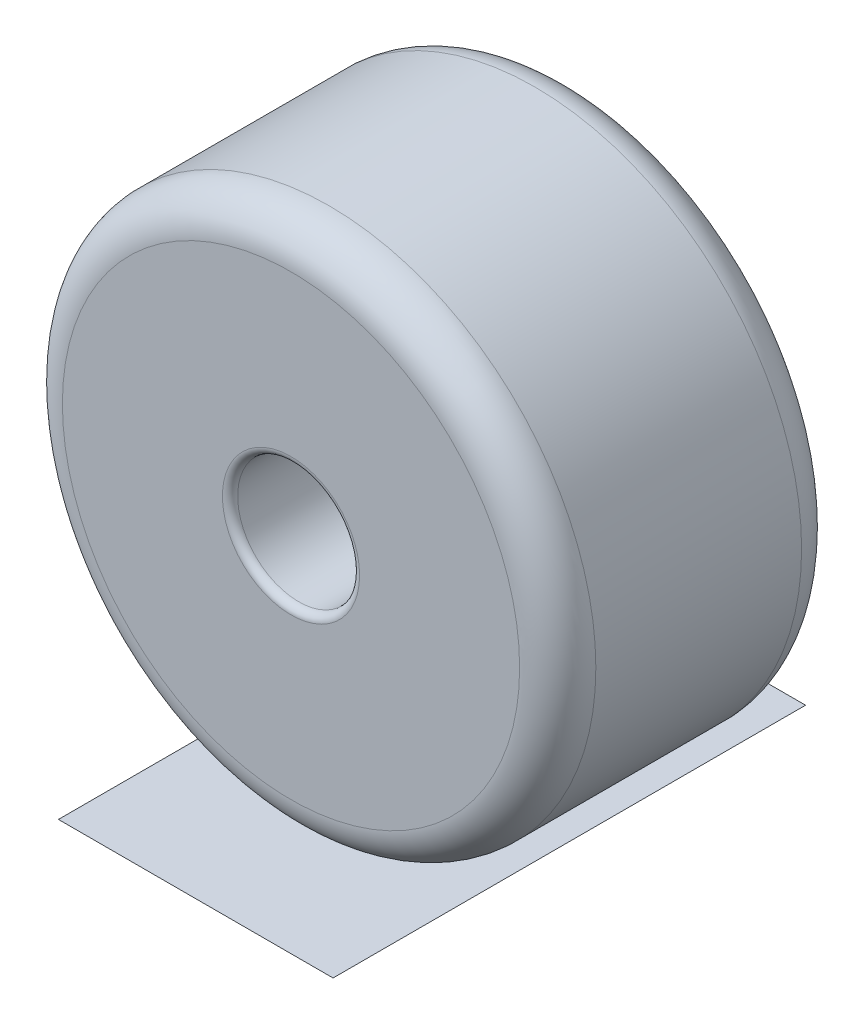
ISO-10303-21;
HEADER;
FILE_DESCRIPTION(('STEP AP214'),'2;1');
FILE_NAME('part.step','',(''),(''),'','','');
FILE_SCHEMA(('AUTOMOTIVE_DESIGN { 1 0 10303 214 1 1 1 1 }'));
ENDSEC;
DATA;
#1=APPLICATION_CONTEXT('core data for automotive mechanical design processes');
#2=APPLICATION_PROTOCOL_DEFINITION('international standard','automotive_design',2000,#1);
#3=PRODUCT_CONTEXT('',#1,'mechanical');
#4=PRODUCT('Part','Part','',(#3));
#5=PRODUCT_RELATED_PRODUCT_CATEGORY('part','',(#4));
#6=PRODUCT_DEFINITION_FORMATION('','',#4);
#7=PRODUCT_DEFINITION_CONTEXT('part definition',#1,'design');
#8=PRODUCT_DEFINITION('design','',#6,#7);
#9=PRODUCT_DEFINITION_SHAPE('','',#8);
#10=(LENGTH_UNIT() NAMED_UNIT(*) SI_UNIT(.MILLI.,.METRE.));
#11=(NAMED_UNIT(*) PLANE_ANGLE_UNIT() SI_UNIT($,.RADIAN.));
#12=(NAMED_UNIT(*) SI_UNIT($,.STERADIAN.) SOLID_ANGLE_UNIT());
#13=UNCERTAINTY_MEASURE_WITH_UNIT(LENGTH_MEASURE(1.E-05),#10,'distance_accuracy_value','');
#14=(GEOMETRIC_REPRESENTATION_CONTEXT(3) GLOBAL_UNCERTAINTY_ASSIGNED_CONTEXT((#13)) GLOBAL_UNIT_ASSIGNED_CONTEXT((#10,
#11,#12)) REPRESENTATION_CONTEXT('',''));
#15=CARTESIAN_POINT('',(0.,0.,0.));
#16=DIRECTION('',(0.,0.,1.));
#17=DIRECTION('',(1.,0.,0.));
#18=AXIS2_PLACEMENT_3D('',#15,#16,#17);
#19=CARTESIAN_POINT('',(-9.00970867579105,-17.5,-15.5));
#20=DIRECTION('',(0.,-1.,0.));
#21=DIRECTION('',(1.,0.,0.));
#22=AXIS2_PLACEMENT_3D('',#19,#20,#21);
#23=PLANE('',#22);
#24=DIRECTION('',(1.,0.,0.));
#25=VECTOR('',#24,1.);
#26=CARTESIAN_POINT('',(-9.00970867579105,-17.5,15.5));
#27=LINE('',#26,#25);
#28=CARTESIAN_POINT('',(-9.00970867579105,-17.5,15.5));
#29=VERTEX_POINT('',#28);
#30=CARTESIAN_POINT('',(9.00970867579105,-17.5,15.5));
#31=VERTEX_POINT('',#30);
#32=EDGE_CURVE('E64',#29,#31,#27,.T.);
#33=ORIENTED_EDGE('',*,*,#32,.F.);
#34=DIRECTION('',(0.,0.,1.));
#35=VECTOR('',#34,1.);
#36=CARTESIAN_POINT('',(-9.00970867579105,-17.5,-15.5));
#37=LINE('',#36,#35);
#38=CARTESIAN_POINT('',(-9.00970867579105,-17.5,-15.5));
#39=VERTEX_POINT('',#38);
#40=EDGE_CURVE('E46',#39,#29,#37,.T.);
#41=ORIENTED_EDGE('',*,*,#40,.F.);
#42=DIRECTION('',(1.,0.,0.));
#43=VECTOR('',#42,1.);
#44=CARTESIAN_POINT('',(-9.00970867579105,-17.5,-15.5));
#45=LINE('',#44,#43);
#46=CARTESIAN_POINT('',(9.00970867579105,-17.5,-15.5));
#47=VERTEX_POINT('',#46);
#48=EDGE_CURVE('E52',#39,#47,#45,.T.);
#49=ORIENTED_EDGE('',*,*,#48,.T.);
#50=DIRECTION('',(0.,0.,1.));
#51=VECTOR('',#50,1.);
#52=CARTESIAN_POINT('',(9.00970867579105,-17.5,-15.5));
#53=LINE('',#52,#51);
#54=EDGE_CURVE('E12',#47,#31,#53,.T.);
#55=ORIENTED_EDGE('',*,*,#54,.T.);
#56=EDGE_LOOP('',(#33,#41,#49,#55));
#57=FACE_BOUND('',#56,.T.);
#58=ADVANCED_FACE('F45',(#57),#23,.T.);
#59=OPEN_SHELL('',(#58));
#60=SHELL_BASED_SURFACE_MODEL('B2',(#59));
#61=CARTESIAN_POINT('',(0.,0.,9.25));
#62=DIRECTION('',(0.,0.,1.));
#63=DIRECTION('',(1.,0.,0.));
#64=AXIS2_PLACEMENT_3D('',#61,#62,#63);
#65=PLANE('',#64);
#66=CARTESIAN_POINT('',(0.,0.,9.25));
#67=DIRECTION('',(0.,0.,1.));
#68=DIRECTION('',(1.,0.,0.));
#69=AXIS2_PLACEMENT_3D('',#66,#67,#68);
#70=CIRCLE('',#69,4.5);
#71=CARTESIAN_POINT('',(4.5,0.,9.25));
#72=VERTEX_POINT('',#71);
#73=EDGE_CURVE('E44',#72,#72,#70,.F.);
#74=ORIENTED_EDGE('',*,*,#73,.T.);
#75=EDGE_LOOP('',(#74));
#76=FACE_BOUND('',#75,.T.);
#77=CARTESIAN_POINT('',(0.,0.,9.25));
#78=DIRECTION('',(0.,0.,1.));
#79=DIRECTION('',(1.,0.,0.));
#80=AXIS2_PLACEMENT_3D('',#77,#78,#79);
#81=CIRCLE('',#80,15.);
#82=CARTESIAN_POINT('',(15.,0.,9.25));
#83=VERTEX_POINT('',#82);
#84=EDGE_CURVE('E109',#83,#83,#81,.T.);
#85=ORIENTED_EDGE('',*,*,#84,.T.);
#86=EDGE_LOOP('',(#85));
#87=FACE_BOUND('',#86,.T.);
#88=ADVANCED_FACE('F89',(#76,#87),#65,.T.);
#89=CARTESIAN_POINT('',(0.,0.,-9.25));
#90=DIRECTION('',(0.,0.,1.));
#91=DIRECTION('',(1.,0.,0.));
#92=AXIS2_PLACEMENT_3D('',#89,#90,#91);
#93=PLANE('',#92);
#94=CARTESIAN_POINT('',(0.,0.,-9.25));
#95=DIRECTION('',(0.,0.,1.));
#96=DIRECTION('',(1.,0.,0.));
#97=AXIS2_PLACEMENT_3D('',#94,#95,#96);
#98=CIRCLE('',#97,4.5);
#99=CARTESIAN_POINT('',(4.5,0.,-9.25));
#100=VERTEX_POINT('',#99);
#101=EDGE_CURVE('E104',#100,#100,#98,.T.);
#102=ORIENTED_EDGE('',*,*,#101,.T.);
#103=EDGE_LOOP('',(#102));
#104=FACE_BOUND('',#103,.T.);
#105=CARTESIAN_POINT('',(0.,0.,-9.25));
#106=DIRECTION('',(0.,0.,1.));
#107=DIRECTION('',(1.,0.,0.));
#108=AXIS2_PLACEMENT_3D('',#105,#106,#107);
#109=CIRCLE('',#108,15.);
#110=CARTESIAN_POINT('',(15.,0.,-9.25));
#111=VERTEX_POINT('',#110);
#112=EDGE_CURVE('E112',#111,#111,#109,.F.);
#113=ORIENTED_EDGE('',*,*,#112,.T.);
#114=EDGE_LOOP('',(#113));
#115=FACE_BOUND('',#114,.T.);
#116=ADVANCED_FACE('F133',(#104,#115),#93,.F.);
#117=CARTESIAN_POINT('',(0.,0.,9.25));
#118=DIRECTION('',(0.,0.,-1.));
#119=DIRECTION('',(-1.,0.,0.));
#120=AXIS2_PLACEMENT_3D('',#117,#118,#119);
#121=CYLINDRICAL_SURFACE('',#120,17.5);
#122=CARTESIAN_POINT('',(0.,0.,-6.75));
#123=DIRECTION('',(0.,0.,1.));
#124=DIRECTION('',(1.,0.,0.));
#125=AXIS2_PLACEMENT_3D('',#122,#123,#124);
#126=CIRCLE('',#125,17.5);
#127=CARTESIAN_POINT('',(17.5,0.,-6.75));
#128=VERTEX_POINT('',#127);
#129=EDGE_CURVE('E115',#128,#128,#126,.T.);
#130=ORIENTED_EDGE('',*,*,#129,.T.);
#131=EDGE_LOOP('',(#130));
#132=FACE_BOUND('',#131,.T.);
#133=CARTESIAN_POINT('',(0.,0.,6.75));
#134=DIRECTION('',(0.,0.,1.));
#135=DIRECTION('',(1.,0.,0.));
#136=AXIS2_PLACEMENT_3D('',#133,#134,#135);
#137=CIRCLE('',#136,17.5);
#138=CARTESIAN_POINT('',(17.5,0.,6.75));
#139=VERTEX_POINT('',#138);
#140=EDGE_CURVE('E118',#139,#139,#137,.F.);
#141=ORIENTED_EDGE('',*,*,#140,.T.);
#142=EDGE_LOOP('',(#141));
#143=FACE_BOUND('',#142,.T.);
#144=ADVANCED_FACE('F122',(#132,#143),#121,.T.);
#145=CARTESIAN_POINT('',(0.,0.,9.25));
#146=DIRECTION('',(0.,0.,-1.));
#147=DIRECTION('',(-1.,0.,0.));
#148=AXIS2_PLACEMENT_3D('',#145,#146,#147);
#149=CYLINDRICAL_SURFACE('',#148,4.);
#150=CARTESIAN_POINT('',(0.,0.,-8.75));
#151=DIRECTION('',(0.,0.,1.));
#152=DIRECTION('',(1.,0.,0.));
#153=AXIS2_PLACEMENT_3D('',#150,#151,#152);
#154=CIRCLE('',#153,4.);
#155=CARTESIAN_POINT('',(4.,0.,-8.75));
#156=VERTEX_POINT('',#155);
#157=EDGE_CURVE('E96',#156,#156,#154,.F.);
#158=ORIENTED_EDGE('',*,*,#157,.T.);
#159=EDGE_LOOP('',(#158));
#160=FACE_BOUND('',#159,.T.);
#161=CARTESIAN_POINT('',(0.,0.,8.75));
#162=DIRECTION('',(0.,0.,1.));
#163=DIRECTION('',(1.,0.,0.));
#164=AXIS2_PLACEMENT_3D('',#161,#162,#163);
#165=CIRCLE('',#164,4.);
#166=CARTESIAN_POINT('',(4.,0.,8.75));
#167=VERTEX_POINT('',#166);
#168=EDGE_CURVE('E100',#167,#167,#165,.T.);
#169=ORIENTED_EDGE('',*,*,#168,.T.);
#170=EDGE_LOOP('',(#169));
#171=FACE_BOUND('',#170,.T.);
#172=ADVANCED_FACE('F141',(#160,#171),#149,.F.);
#173=CARTESIAN_POINT('',(0.,0.,-6.75));
#174=DIRECTION('',(0.,0.,1.));
#175=DIRECTION('',(1.,0.,0.));
#176=AXIS2_PLACEMENT_3D('',#173,#174,#175);
#177=TOROIDAL_SURFACE('',#176,15.,2.5);
#178=ORIENTED_EDGE('',*,*,#112,.F.);
#179=EDGE_LOOP('',(#178));
#180=FACE_BOUND('',#179,.T.);
#181=ORIENTED_EDGE('',*,*,#129,.F.);
#182=EDGE_LOOP('',(#181));
#183=FACE_BOUND('',#182,.T.);
#184=ADVANCED_FACE('F128',(#180,#183),#177,.T.);
#185=CARTESIAN_POINT('',(0.,0.,6.75));
#186=DIRECTION('',(0.,0.,1.));
#187=DIRECTION('',(1.,0.,0.));
#188=AXIS2_PLACEMENT_3D('',#185,#186,#187);
#189=TOROIDAL_SURFACE('',#188,15.,2.5);
#190=ORIENTED_EDGE('',*,*,#140,.F.);
#191=EDGE_LOOP('',(#190));
#192=FACE_BOUND('',#191,.T.);
#193=ORIENTED_EDGE('',*,*,#84,.F.);
#194=EDGE_LOOP('',(#193));
#195=FACE_BOUND('',#194,.T.);
#196=ADVANCED_FACE('F124',(#192,#195),#189,.T.);
#197=CARTESIAN_POINT('',(0.,0.,-8.75));
#198=DIRECTION('',(0.,0.,1.));
#199=DIRECTION('',(1.,0.,0.));
#200=AXIS2_PLACEMENT_3D('',#197,#198,#199);
#201=TOROIDAL_SURFACE('',#200,4.5,0.5);
#202=ORIENTED_EDGE('',*,*,#157,.F.);
#203=EDGE_LOOP('',(#202));
#204=FACE_BOUND('',#203,.T.);
#205=ORIENTED_EDGE('',*,*,#101,.F.);
#206=EDGE_LOOP('',(#205));
#207=FACE_BOUND('',#206,.T.);
#208=ADVANCED_FACE('F127',(#204,#207),#201,.T.);
#209=CARTESIAN_POINT('',(0.,0.,8.75));
#210=DIRECTION('',(0.,0.,1.));
#211=DIRECTION('',(1.,0.,0.));
#212=AXIS2_PLACEMENT_3D('',#209,#210,#211);
#213=TOROIDAL_SURFACE('',#212,4.5,0.5);
#214=ORIENTED_EDGE('',*,*,#73,.F.);
#215=EDGE_LOOP('',(#214));
#216=FACE_BOUND('',#215,.T.);
#217=ORIENTED_EDGE('',*,*,#168,.F.);
#218=EDGE_LOOP('',(#217));
#219=FACE_BOUND('',#218,.T.);
#220=ADVANCED_FACE('F91',(#216,#219),#213,.T.);
#221=CLOSED_SHELL('',(#88,#116,#144,#172,#184,#196,#208,#220));
#222=MANIFOLD_SOLID_BREP('B6',#221);
#223=ADVANCED_BREP_SHAPE_REPRESENTATION('',(#18,#222),#14);
#224=MANIFOLD_SURFACE_SHAPE_REPRESENTATION('',(#18,#60),#14);
#225=SHAPE_REPRESENTATION('',(#18),#14);
#226=SHAPE_DEFINITION_REPRESENTATION(#9,#225);
#227=SHAPE_REPRESENTATION_RELATIONSHIP('','',#225,#223);
#228=SHAPE_REPRESENTATION_RELATIONSHIP('','',#225,#224);
ENDSEC;
END-ISO-10303-21;
